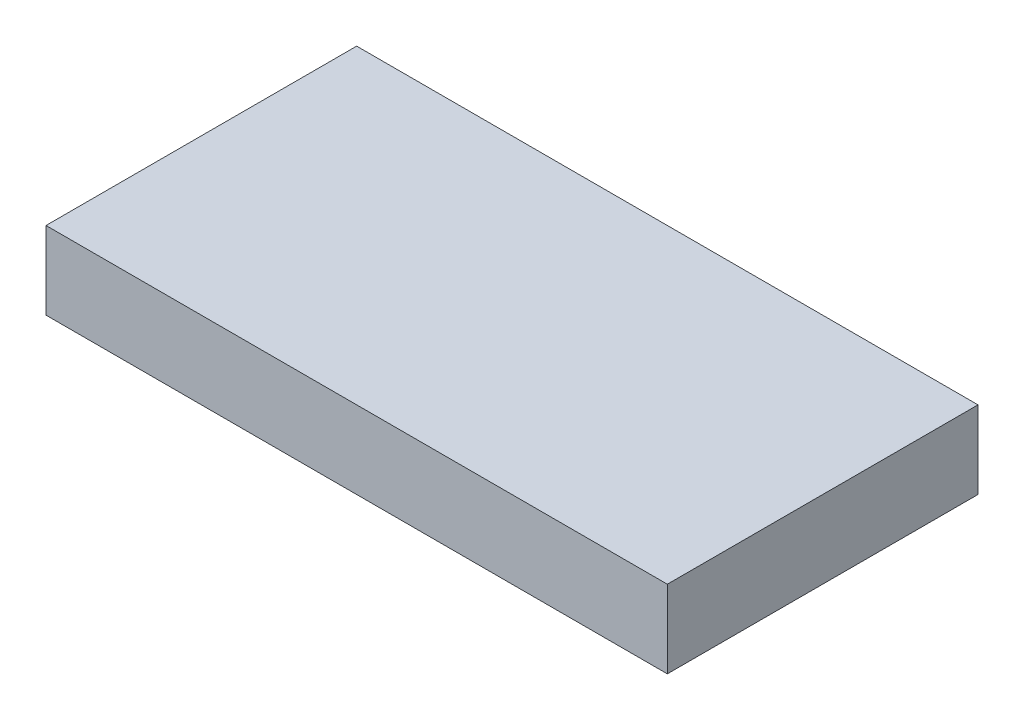
ISO-10303-21;
HEADER;
FILE_DESCRIPTION(('STEP AP214'),'2;1');
FILE_NAME('part.step','',(''),(''),'','','');
FILE_SCHEMA(('AUTOMOTIVE_DESIGN { 1 0 10303 214 1 1 1 1 }'));
ENDSEC;
DATA;
#1=APPLICATION_CONTEXT('core data for automotive mechanical design processes');
#2=APPLICATION_PROTOCOL_DEFINITION('international standard','automotive_design',2000,#1);
#3=PRODUCT_CONTEXT('',#1,'mechanical');
#4=PRODUCT('Part','Part','',(#3));
#5=PRODUCT_RELATED_PRODUCT_CATEGORY('part','',(#4));
#6=PRODUCT_DEFINITION_FORMATION('','',#4);
#7=PRODUCT_DEFINITION_CONTEXT('part definition',#1,'design');
#8=PRODUCT_DEFINITION('design','',#6,#7);
#9=PRODUCT_DEFINITION_SHAPE('','',#8);
#10=(LENGTH_UNIT() NAMED_UNIT(*) SI_UNIT(.MILLI.,.METRE.));
#11=(NAMED_UNIT(*) PLANE_ANGLE_UNIT() SI_UNIT($,.RADIAN.));
#12=(NAMED_UNIT(*) SI_UNIT($,.STERADIAN.) SOLID_ANGLE_UNIT());
#13=UNCERTAINTY_MEASURE_WITH_UNIT(LENGTH_MEASURE(1.E-05),#10,'distance_accuracy_value','');
#14=(GEOMETRIC_REPRESENTATION_CONTEXT(3) GLOBAL_UNCERTAINTY_ASSIGNED_CONTEXT((#13)) GLOBAL_UNIT_ASSIGNED_CONTEXT((#10,
#11,#12)) REPRESENTATION_CONTEXT('',''));
#15=CARTESIAN_POINT('',(0.,0.,0.));
#16=DIRECTION('',(0.,0.,1.));
#17=DIRECTION('',(1.,0.,0.));
#18=AXIS2_PLACEMENT_3D('',#15,#16,#17);
#19=CARTESIAN_POINT('',(200.,50.,-100.));
#20=DIRECTION('',(-1.,0.,0.));
#21=DIRECTION('',(0.,0.,1.));
#22=AXIS2_PLACEMENT_3D('',#19,#20,#21);
#23=PLANE('',#22);
#24=DIRECTION('',(0.,0.,-1.));
#25=VECTOR('',#24,1.);
#26=CARTESIAN_POINT('',(200.,0.,-100.));
#27=LINE('',#26,#25);
#28=CARTESIAN_POINT('',(200.,0.,100.));
#29=VERTEX_POINT('',#28);
#30=CARTESIAN_POINT('',(200.,0.,-100.));
#31=VERTEX_POINT('',#30);
#32=EDGE_CURVE('E96',#29,#31,#27,.T.);
#33=ORIENTED_EDGE('',*,*,#32,.T.);
#34=DIRECTION('',(0.,-1.,0.));
#35=VECTOR('',#34,1.);
#36=CARTESIAN_POINT('',(200.,50.,-100.));
#37=LINE('',#36,#35);
#38=CARTESIAN_POINT('',(200.,50.,-100.));
#39=VERTEX_POINT('',#38);
#40=EDGE_CURVE('E11',#39,#31,#37,.T.);
#41=ORIENTED_EDGE('',*,*,#40,.F.);
#42=DIRECTION('',(0.,0.,-1.));
#43=VECTOR('',#42,1.);
#44=CARTESIAN_POINT('',(200.,50.,-100.));
#45=LINE('',#44,#43);
#46=CARTESIAN_POINT('',(200.,50.,100.));
#47=VERTEX_POINT('',#46);
#48=EDGE_CURVE('E84',#47,#39,#45,.T.);
#49=ORIENTED_EDGE('',*,*,#48,.F.);
#50=DIRECTION('',(0.,-1.,0.));
#51=VECTOR('',#50,1.);
#52=CARTESIAN_POINT('',(200.,50.,100.));
#53=LINE('',#52,#51);
#54=EDGE_CURVE('E92',#47,#29,#53,.T.);
#55=ORIENTED_EDGE('',*,*,#54,.T.);
#56=EDGE_LOOP('',(#33,#41,#49,#55));
#57=FACE_BOUND('',#56,.T.);
#58=ADVANCED_FACE('F33',(#57),#23,.F.);
#59=CARTESIAN_POINT('',(-200.,50.,-100.));
#60=DIRECTION('',(0.,0.,1.));
#61=DIRECTION('',(1.,0.,0.));
#62=AXIS2_PLACEMENT_3D('',#59,#60,#61);
#63=PLANE('',#62);
#64=DIRECTION('',(-1.,0.,0.));
#65=VECTOR('',#64,1.);
#66=CARTESIAN_POINT('',(-200.,0.,-100.));
#67=LINE('',#66,#65);
#68=CARTESIAN_POINT('',(-200.,0.,-100.));
#69=VERTEX_POINT('',#68);
#70=EDGE_CURVE('E88',#31,#69,#67,.T.);
#71=ORIENTED_EDGE('',*,*,#70,.T.);
#72=DIRECTION('',(0.,-1.,0.));
#73=VECTOR('',#72,1.);
#74=CARTESIAN_POINT('',(-200.,50.,-100.));
#75=LINE('',#74,#73);
#76=CARTESIAN_POINT('',(-200.,50.,-100.));
#77=VERTEX_POINT('',#76);
#78=EDGE_CURVE('E41',#77,#69,#75,.T.);
#79=ORIENTED_EDGE('',*,*,#78,.F.);
#80=DIRECTION('',(-1.,0.,0.));
#81=VECTOR('',#80,1.);
#82=CARTESIAN_POINT('',(-200.,50.,-100.));
#83=LINE('',#82,#81);
#84=EDGE_CURVE('E79',#39,#77,#83,.T.);
#85=ORIENTED_EDGE('',*,*,#84,.F.);
#86=ORIENTED_EDGE('',*,*,#40,.T.);
#87=EDGE_LOOP('',(#71,#79,#85,#86));
#88=FACE_BOUND('',#87,.T.);
#89=ADVANCED_FACE('F87',(#88),#63,.F.);
#90=CARTESIAN_POINT('',(-200.,50.,-100.));
#91=DIRECTION('',(1.,0.,0.));
#92=DIRECTION('',(0.,0.,-1.));
#93=AXIS2_PLACEMENT_3D('',#90,#91,#92);
#94=PLANE('',#93);
#95=DIRECTION('',(0.,0.,1.));
#96=VECTOR('',#95,1.);
#97=CARTESIAN_POINT('',(-200.,0.,-100.));
#98=LINE('',#97,#96);
#99=CARTESIAN_POINT('',(-200.,0.,100.));
#100=VERTEX_POINT('',#99);
#101=EDGE_CURVE('E66',#69,#100,#98,.T.);
#102=ORIENTED_EDGE('',*,*,#101,.T.);
#103=DIRECTION('',(0.,-1.,0.));
#104=VECTOR('',#103,1.);
#105=CARTESIAN_POINT('',(-200.,50.,100.));
#106=LINE('',#105,#104);
#107=CARTESIAN_POINT('',(-200.,50.,100.));
#108=VERTEX_POINT('',#107);
#109=EDGE_CURVE('E89',#108,#100,#106,.T.);
#110=ORIENTED_EDGE('',*,*,#109,.F.);
#111=DIRECTION('',(0.,0.,1.));
#112=VECTOR('',#111,1.);
#113=CARTESIAN_POINT('',(-200.,50.,-100.));
#114=LINE('',#113,#112);
#115=EDGE_CURVE('E82',#77,#108,#114,.T.);
#116=ORIENTED_EDGE('',*,*,#115,.F.);
#117=ORIENTED_EDGE('',*,*,#78,.T.);
#118=EDGE_LOOP('',(#102,#110,#116,#117));
#119=FACE_BOUND('',#118,.T.);
#120=ADVANCED_FACE('F90',(#119),#94,.F.);
#121=CARTESIAN_POINT('',(-200.,50.,100.));
#122=DIRECTION('',(0.,0.,-1.));
#123=DIRECTION('',(-1.,0.,0.));
#124=AXIS2_PLACEMENT_3D('',#121,#122,#123);
#125=PLANE('',#124);
#126=DIRECTION('',(1.,0.,0.));
#127=VECTOR('',#126,1.);
#128=CARTESIAN_POINT('',(-200.,0.,100.));
#129=LINE('',#128,#127);
#130=EDGE_CURVE('E72',#100,#29,#129,.T.);
#131=ORIENTED_EDGE('',*,*,#130,.T.);
#132=ORIENTED_EDGE('',*,*,#54,.F.);
#133=DIRECTION('',(1.,0.,0.));
#134=VECTOR('',#133,1.);
#135=CARTESIAN_POINT('',(-200.,50.,100.));
#136=LINE('',#135,#134);
#137=EDGE_CURVE('E49',#108,#47,#136,.T.);
#138=ORIENTED_EDGE('',*,*,#137,.F.);
#139=ORIENTED_EDGE('',*,*,#109,.T.);
#140=EDGE_LOOP('',(#131,#132,#138,#139));
#141=FACE_BOUND('',#140,.T.);
#142=ADVANCED_FACE('F103',(#141),#125,.F.);
#143=CARTESIAN_POINT('',(0.,50.,0.));
#144=DIRECTION('',(0.,1.,0.));
#145=DIRECTION('',(0.,0.,1.));
#146=AXIS2_PLACEMENT_3D('',#143,#144,#145);
#147=PLANE('',#146);
#148=ORIENTED_EDGE('',*,*,#48,.T.);
#149=ORIENTED_EDGE('',*,*,#84,.T.);
#150=ORIENTED_EDGE('',*,*,#115,.T.);
#151=ORIENTED_EDGE('',*,*,#137,.T.);
#152=EDGE_LOOP('',(#148,#149,#150,#151));
#153=FACE_BOUND('',#152,.T.);
#154=ADVANCED_FACE('F80',(#153),#147,.T.);
#155=CARTESIAN_POINT('',(0.,0.,0.));
#156=DIRECTION('',(0.,1.,0.));
#157=DIRECTION('',(0.,0.,1.));
#158=AXIS2_PLACEMENT_3D('',#155,#156,#157);
#159=PLANE('',#158);
#160=ORIENTED_EDGE('',*,*,#32,.F.);
#161=ORIENTED_EDGE('',*,*,#130,.F.);
#162=ORIENTED_EDGE('',*,*,#101,.F.);
#163=ORIENTED_EDGE('',*,*,#70,.F.);
#164=EDGE_LOOP('',(#160,#161,#162,#163));
#165=FACE_BOUND('',#164,.T.);
#166=ADVANCED_FACE('F106',(#165),#159,.F.);
#167=CLOSED_SHELL('',(#58,#89,#120,#142,#154,#166));
#168=MANIFOLD_SOLID_BREP('B2',#167);
#169=ADVANCED_BREP_SHAPE_REPRESENTATION('',(#18,#168),#14);
#170=SHAPE_DEFINITION_REPRESENTATION(#9,#169);
ENDSEC;
END-ISO-10303-21;
